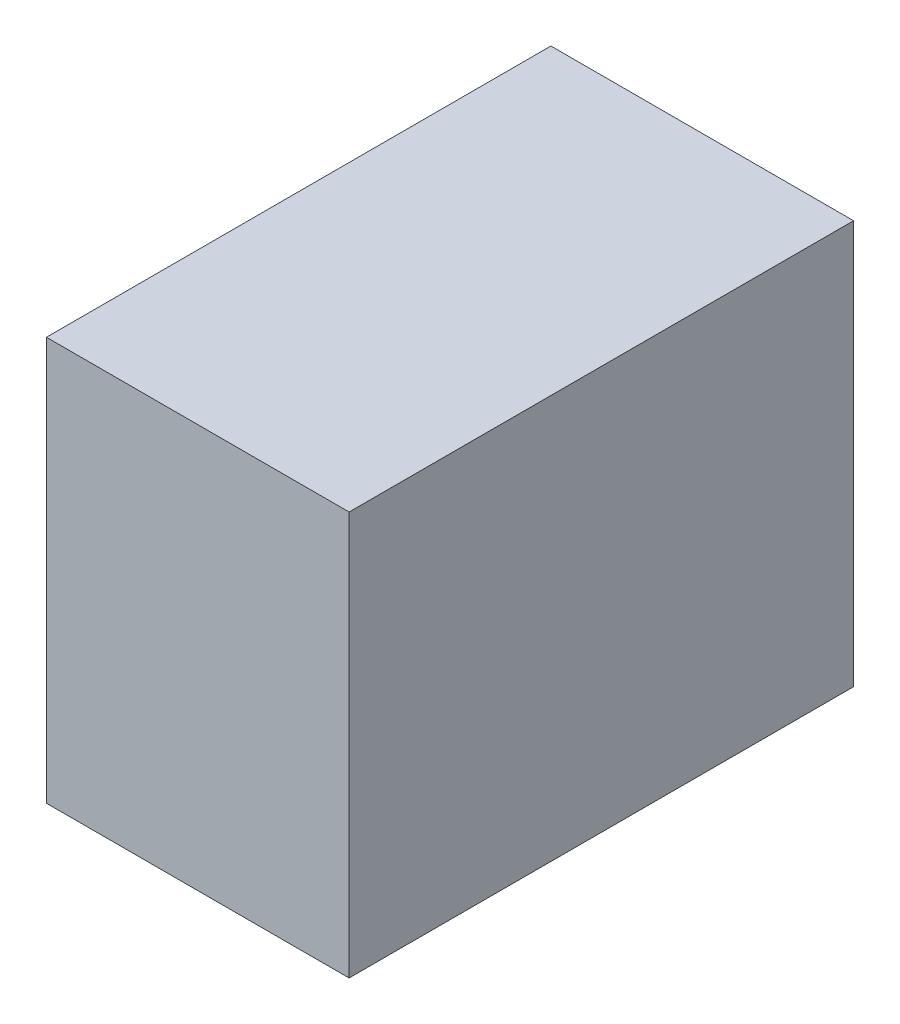
ISO-10303-21;
HEADER;
FILE_DESCRIPTION(('STEP AP214'),'2;1');
FILE_NAME('part.step','',(''),(''),'','','');
FILE_SCHEMA(('AUTOMOTIVE_DESIGN { 1 0 10303 214 1 1 1 1 }'));
ENDSEC;
DATA;
#1=APPLICATION_CONTEXT('core data for automotive mechanical design processes');
#2=APPLICATION_PROTOCOL_DEFINITION('international standard','automotive_design',2000,#1);
#3=PRODUCT_CONTEXT('',#1,'mechanical');
#4=PRODUCT('Part','Part','',(#3));
#5=PRODUCT_RELATED_PRODUCT_CATEGORY('part','',(#4));
#6=PRODUCT_DEFINITION_FORMATION('','',#4);
#7=PRODUCT_DEFINITION_CONTEXT('part definition',#1,'design');
#8=PRODUCT_DEFINITION('design','',#6,#7);
#9=PRODUCT_DEFINITION_SHAPE('','',#8);
#10=(LENGTH_UNIT() NAMED_UNIT(*) SI_UNIT(.MILLI.,.METRE.));
#11=(NAMED_UNIT(*) PLANE_ANGLE_UNIT() SI_UNIT($,.RADIAN.));
#12=(NAMED_UNIT(*) SI_UNIT($,.STERADIAN.) SOLID_ANGLE_UNIT());
#13=UNCERTAINTY_MEASURE_WITH_UNIT(LENGTH_MEASURE(1.E-05),#10,'distance_accuracy_value','');
#14=(GEOMETRIC_REPRESENTATION_CONTEXT(3) GLOBAL_UNCERTAINTY_ASSIGNED_CONTEXT((#13)) GLOBAL_UNIT_ASSIGNED_CONTEXT((#10,
#11,#12)) REPRESENTATION_CONTEXT('',''));
#15=CARTESIAN_POINT('',(0.,0.,0.));
#16=DIRECTION('',(0.,0.,1.));
#17=DIRECTION('',(1.,0.,0.));
#18=AXIS2_PLACEMENT_3D('',#15,#16,#17);
#19=CARTESIAN_POINT('',(-38.1,50.8,127.));
#20=DIRECTION('',(1.,0.,0.));
#21=DIRECTION('',(0.,1.,0.));
#22=AXIS2_PLACEMENT_3D('',#19,#20,#21);
#23=PLANE('',#22);
#24=DIRECTION('',(0.,-1.,0.));
#25=VECTOR('',#24,1.);
#26=CARTESIAN_POINT('',(-38.1,50.8,0.));
#27=LINE('',#26,#25);
#28=CARTESIAN_POINT('',(-38.1,50.8,0.));
#29=VERTEX_POINT('',#28);
#30=CARTESIAN_POINT('',(-38.1,-50.8,0.));
#31=VERTEX_POINT('',#30);
#32=EDGE_CURVE('E97',#29,#31,#27,.T.);
#33=ORIENTED_EDGE('',*,*,#32,.T.);
#34=DIRECTION('',(0.,0.,-1.));
#35=VECTOR('',#34,1.);
#36=CARTESIAN_POINT('',(-38.1,-50.8,127.));
#37=LINE('',#36,#35);
#38=CARTESIAN_POINT('',(-38.1,-50.8,127.));
#39=VERTEX_POINT('',#38);
#40=EDGE_CURVE('E11',#39,#31,#37,.T.);
#41=ORIENTED_EDGE('',*,*,#40,.F.);
#42=DIRECTION('',(0.,-1.,0.));
#43=VECTOR('',#42,1.);
#44=CARTESIAN_POINT('',(-38.1,50.8,127.));
#45=LINE('',#44,#43);
#46=CARTESIAN_POINT('',(-38.1,50.8,127.));
#47=VERTEX_POINT('',#46);
#48=EDGE_CURVE('E85',#47,#39,#45,.T.);
#49=ORIENTED_EDGE('',*,*,#48,.F.);
#50=DIRECTION('',(0.,0.,-1.));
#51=VECTOR('',#50,1.);
#52=CARTESIAN_POINT('',(-38.1,50.8,127.));
#53=LINE('',#52,#51);
#54=EDGE_CURVE('E93',#47,#29,#53,.T.);
#55=ORIENTED_EDGE('',*,*,#54,.T.);
#56=EDGE_LOOP('',(#33,#41,#49,#55));
#57=FACE_BOUND('',#56,.T.);
#58=ADVANCED_FACE('F34',(#57),#23,.F.);
#59=CARTESIAN_POINT('',(-38.1,-50.8,127.));
#60=DIRECTION('',(0.,1.,0.));
#61=DIRECTION('',(0.,0.,1.));
#62=AXIS2_PLACEMENT_3D('',#59,#60,#61);
#63=PLANE('',#62);
#64=DIRECTION('',(1.,0.,0.));
#65=VECTOR('',#64,1.);
#66=CARTESIAN_POINT('',(-38.1,-50.8,0.));
#67=LINE('',#66,#65);
#68=CARTESIAN_POINT('',(38.1,-50.8,0.));
#69=VERTEX_POINT('',#68);
#70=EDGE_CURVE('E89',#31,#69,#67,.T.);
#71=ORIENTED_EDGE('',*,*,#70,.T.);
#72=DIRECTION('',(0.,0.,-1.));
#73=VECTOR('',#72,1.);
#74=CARTESIAN_POINT('',(38.1,-50.8,127.));
#75=LINE('',#74,#73);
#76=CARTESIAN_POINT('',(38.1,-50.8,127.));
#77=VERTEX_POINT('',#76);
#78=EDGE_CURVE('E42',#77,#69,#75,.T.);
#79=ORIENTED_EDGE('',*,*,#78,.F.);
#80=DIRECTION('',(1.,0.,0.));
#81=VECTOR('',#80,1.);
#82=CARTESIAN_POINT('',(-38.1,-50.8,127.));
#83=LINE('',#82,#81);
#84=EDGE_CURVE('E80',#39,#77,#83,.T.);
#85=ORIENTED_EDGE('',*,*,#84,.F.);
#86=ORIENTED_EDGE('',*,*,#40,.T.);
#87=EDGE_LOOP('',(#71,#79,#85,#86));
#88=FACE_BOUND('',#87,.T.);
#89=ADVANCED_FACE('F88',(#88),#63,.F.);
#90=CARTESIAN_POINT('',(38.1,50.8,127.));
#91=DIRECTION('',(-1.,0.,0.));
#92=DIRECTION('',(0.,-1.,0.));
#93=AXIS2_PLACEMENT_3D('',#90,#91,#92);
#94=PLANE('',#93);
#95=DIRECTION('',(0.,1.,0.));
#96=VECTOR('',#95,1.);
#97=CARTESIAN_POINT('',(38.1,50.8,0.));
#98=LINE('',#97,#96);
#99=CARTESIAN_POINT('',(38.1,50.8,0.));
#100=VERTEX_POINT('',#99);
#101=EDGE_CURVE('E67',#69,#100,#98,.T.);
#102=ORIENTED_EDGE('',*,*,#101,.T.);
#103=DIRECTION('',(0.,0.,-1.));
#104=VECTOR('',#103,1.);
#105=CARTESIAN_POINT('',(38.1,50.8,127.));
#106=LINE('',#105,#104);
#107=CARTESIAN_POINT('',(38.1,50.8,127.));
#108=VERTEX_POINT('',#107);
#109=EDGE_CURVE('E90',#108,#100,#106,.T.);
#110=ORIENTED_EDGE('',*,*,#109,.F.);
#111=DIRECTION('',(0.,1.,0.));
#112=VECTOR('',#111,1.);
#113=CARTESIAN_POINT('',(38.1,50.8,127.));
#114=LINE('',#113,#112);
#115=EDGE_CURVE('E83',#77,#108,#114,.T.);
#116=ORIENTED_EDGE('',*,*,#115,.F.);
#117=ORIENTED_EDGE('',*,*,#78,.T.);
#118=EDGE_LOOP('',(#102,#110,#116,#117));
#119=FACE_BOUND('',#118,.T.);
#120=ADVANCED_FACE('F91',(#119),#94,.F.);
#121=CARTESIAN_POINT('',(-38.1,50.8,127.));
#122=DIRECTION('',(0.,-1.,0.));
#123=DIRECTION('',(0.,0.,-1.));
#124=AXIS2_PLACEMENT_3D('',#121,#122,#123);
#125=PLANE('',#124);
#126=DIRECTION('',(-1.,0.,0.));
#127=VECTOR('',#126,1.);
#128=CARTESIAN_POINT('',(-38.1,50.8,0.));
#129=LINE('',#128,#127);
#130=EDGE_CURVE('E73',#100,#29,#129,.T.);
#131=ORIENTED_EDGE('',*,*,#130,.T.);
#132=ORIENTED_EDGE('',*,*,#54,.F.);
#133=DIRECTION('',(-1.,0.,0.));
#134=VECTOR('',#133,1.);
#135=CARTESIAN_POINT('',(-38.1,50.8,127.));
#136=LINE('',#135,#134);
#137=EDGE_CURVE('E50',#108,#47,#136,.T.);
#138=ORIENTED_EDGE('',*,*,#137,.F.);
#139=ORIENTED_EDGE('',*,*,#109,.T.);
#140=EDGE_LOOP('',(#131,#132,#138,#139));
#141=FACE_BOUND('',#140,.T.);
#142=ADVANCED_FACE('F104',(#141),#125,.F.);
#143=CARTESIAN_POINT('',(0.,0.,127.));
#144=DIRECTION('',(0.,0.,1.));
#145=DIRECTION('',(1.,0.,0.));
#146=AXIS2_PLACEMENT_3D('',#143,#144,#145);
#147=PLANE('',#146);
#148=ORIENTED_EDGE('',*,*,#48,.T.);
#149=ORIENTED_EDGE('',*,*,#84,.T.);
#150=ORIENTED_EDGE('',*,*,#115,.T.);
#151=ORIENTED_EDGE('',*,*,#137,.T.);
#152=EDGE_LOOP('',(#148,#149,#150,#151));
#153=FACE_BOUND('',#152,.T.);
#154=ADVANCED_FACE('F81',(#153),#147,.T.);
#155=CARTESIAN_POINT('',(0.,0.,0.));
#156=DIRECTION('',(0.,0.,1.));
#157=DIRECTION('',(1.,0.,0.));
#158=AXIS2_PLACEMENT_3D('',#155,#156,#157);
#159=PLANE('',#158);
#160=ORIENTED_EDGE('',*,*,#32,.F.);
#161=ORIENTED_EDGE('',*,*,#130,.F.);
#162=ORIENTED_EDGE('',*,*,#101,.F.);
#163=ORIENTED_EDGE('',*,*,#70,.F.);
#164=EDGE_LOOP('',(#160,#161,#162,#163));
#165=FACE_BOUND('',#164,.T.);
#166=ADVANCED_FACE('F107',(#165),#159,.F.);
#167=CLOSED_SHELL('',(#58,#89,#120,#142,#154,#166));
#168=MANIFOLD_SOLID_BREP('B2',#167);
#169=ADVANCED_BREP_SHAPE_REPRESENTATION('',(#18,#168),#14);
#170=SHAPE_DEFINITION_REPRESENTATION(#9,#169);
ENDSEC;
END-ISO-10303-21;
